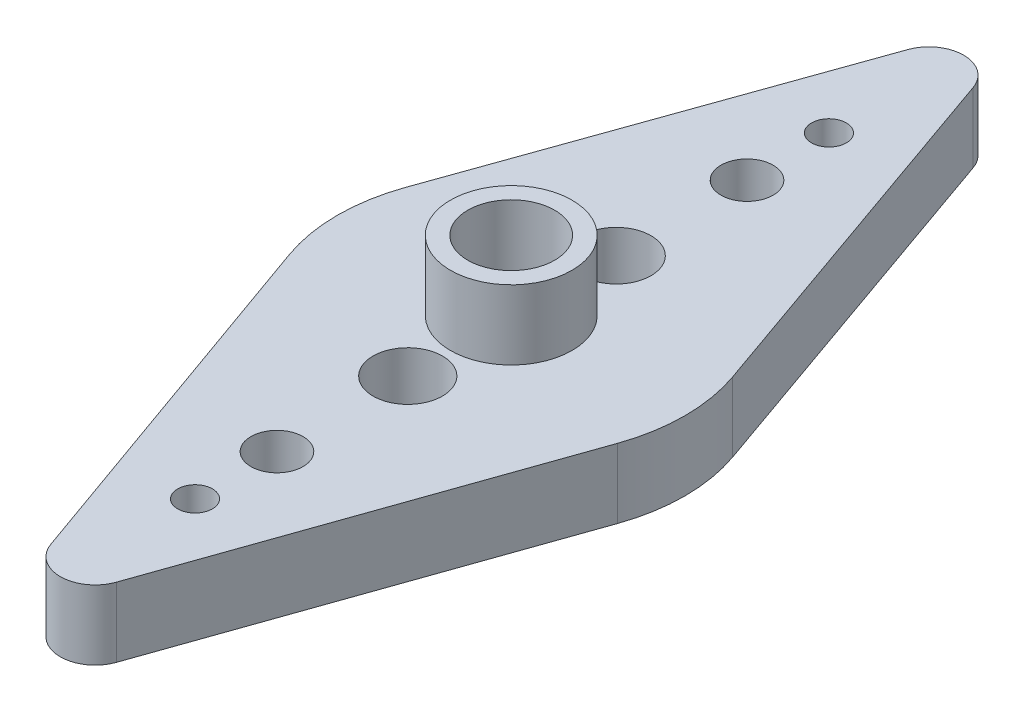
ISO-10303-21;
HEADER;
FILE_DESCRIPTION(('STEP AP214'),'2;1');
FILE_NAME('part.step','',(''),(''),'','','');
FILE_SCHEMA(('AUTOMOTIVE_DESIGN { 1 0 10303 214 1 1 1 1 }'));
ENDSEC;
DATA;
#1=APPLICATION_CONTEXT('core data for automotive mechanical design processes');
#2=APPLICATION_PROTOCOL_DEFINITION('international standard','automotive_design',2000,#1);
#3=PRODUCT_CONTEXT('',#1,'mechanical');
#4=PRODUCT('Part','Part','',(#3));
#5=PRODUCT_RELATED_PRODUCT_CATEGORY('part','',(#4));
#6=PRODUCT_DEFINITION_FORMATION('','',#4);
#7=PRODUCT_DEFINITION_CONTEXT('part definition',#1,'design');
#8=PRODUCT_DEFINITION('design','',#6,#7);
#9=PRODUCT_DEFINITION_SHAPE('','',#8);
#10=(LENGTH_UNIT() NAMED_UNIT(*) SI_UNIT(.MILLI.,.METRE.));
#11=(NAMED_UNIT(*) PLANE_ANGLE_UNIT() SI_UNIT($,.RADIAN.));
#12=(NAMED_UNIT(*) SI_UNIT($,.STERADIAN.) SOLID_ANGLE_UNIT());
#13=UNCERTAINTY_MEASURE_WITH_UNIT(LENGTH_MEASURE(1.E-05),#10,'distance_accuracy_value','');
#14=(GEOMETRIC_REPRESENTATION_CONTEXT(3) GLOBAL_UNCERTAINTY_ASSIGNED_CONTEXT((#13)) GLOBAL_UNIT_ASSIGNED_CONTEXT((#10,
#11,#12)) REPRESENTATION_CONTEXT('',''));
#15=CARTESIAN_POINT('',(0.,0.,0.));
#16=DIRECTION('',(0.,0.,1.));
#17=DIRECTION('',(1.,0.,0.));
#18=AXIS2_PLACEMENT_3D('',#15,#16,#17);
#19=CARTESIAN_POINT('',(0.,2.,0.));
#20=DIRECTION('',(0.,1.,0.));
#21=DIRECTION('',(0.,0.,1.));
#22=AXIS2_PLACEMENT_3D('',#19,#20,#21);
#23=PLANE('',#22);
#24=CARTESIAN_POINT('',(0.,2.,0.));
#25=DIRECTION('',(0.,1.,0.));
#26=DIRECTION('',(1.,0.,0.));
#27=AXIS2_PLACEMENT_3D('',#24,#25,#26);
#28=CIRCLE('',#27,1.75);
#29=CARTESIAN_POINT('',(1.75,2.,0.));
#30=VERTEX_POINT('',#29);
#31=EDGE_CURVE('E226',#30,#30,#28,.T.);
#32=ORIENTED_EDGE('',*,*,#31,.F.);
#33=EDGE_LOOP('',(#32));
#34=FACE_BOUND('',#33,.T.);
#35=CARTESIAN_POINT('',(0.0221712679038221,2.,6.76498149261645));
#36=DIRECTION('',(0.,1.,0.));
#37=DIRECTION('',(0.,0.,-1.));
#38=AXIS2_PLACEMENT_3D('',#35,#36,#37);
#39=CIRCLE('',#38,0.75);
#40=CARTESIAN_POINT('',(0.0221712679038221,2.,6.01498149261645));
#41=VERTEX_POINT('',#40);
#42=EDGE_CURVE('E211',#41,#41,#39,.T.);
#43=ORIENTED_EDGE('',*,*,#42,.F.);
#44=EDGE_LOOP('',(#43));
#45=FACE_BOUND('',#44,.T.);
#46=CARTESIAN_POINT('',(0.0221712679038221,2.,-3.000162006117));
#47=DIRECTION('',(0.,1.,0.));
#48=DIRECTION('',(0.,0.,1.));
#49=AXIS2_PLACEMENT_3D('',#46,#47,#48);
#50=CIRCLE('',#49,1.);
#51=CARTESIAN_POINT('',(0.0221712679038221,2.,-2.000162006117));
#52=VERTEX_POINT('',#51);
#53=EDGE_CURVE('E199',#52,#52,#50,.T.);
#54=ORIENTED_EDGE('',*,*,#53,.F.);
#55=EDGE_LOOP('',(#54));
#56=FACE_BOUND('',#55,.T.);
#57=CARTESIAN_POINT('',(0.0221712679038221,2.,-9.12239182528433));
#58=DIRECTION('',(0.,1.,0.));
#59=DIRECTION('',(0.,0.,1.));
#60=AXIS2_PLACEMENT_3D('',#57,#58,#59);
#61=CIRCLE('',#60,0.5);
#62=CARTESIAN_POINT('',(0.0221712679038221,2.,-8.62239182528432));
#63=VERTEX_POINT('',#62);
#64=EDGE_CURVE('E141',#63,#63,#61,.T.);
#65=ORIENTED_EDGE('',*,*,#64,.F.);
#66=EDGE_LOOP('',(#65));
#67=FACE_BOUND('',#66,.T.);
#68=CARTESIAN_POINT('',(0.,2.,0.));
#69=DIRECTION('',(0.,1.,0.));
#70=DIRECTION('',(0.,0.,1.));
#71=AXIS2_PLACEMENT_3D('',#68,#69,#70);
#72=CIRCLE('',#71,5.);
#73=CARTESIAN_POINT('',(4.71711650462551,2.,1.65795412535741));
#74=VERTEX_POINT('',#73);
#75=CARTESIAN_POINT('',(4.71711650462551,2.,-1.65795412535741));
#76=VERTEX_POINT('',#75);
#77=EDGE_CURVE('E152',#74,#76,#72,.T.);
#78=ORIENTED_EDGE('',*,*,#77,.T.);
#79=DIRECTION('',(-0.331590825071481,0.,-0.943423300925101));
#80=VECTOR('',#79,1.);
#81=CARTESIAN_POINT('',(0.965594568828934,2.,-12.331570343174));
#82=LINE('',#81,#80);
#83=CARTESIAN_POINT('',(0.965594568828934,2.,-12.331570343174));
#84=VERTEX_POINT('',#83);
#85=EDGE_CURVE('E100',#76,#84,#82,.T.);
#86=ORIENTED_EDGE('',*,*,#85,.T.);
#87=CARTESIAN_POINT('',(0.0221712679038221,2.,-11.9999795181025));
#88=DIRECTION('',(0.,1.,0.));
#89=DIRECTION('',(0.,0.,1.));
#90=AXIS2_PLACEMENT_3D('',#87,#88,#89);
#91=CIRCLE('',#90,1.);
#92=CARTESIAN_POINT('',(-0.920020295915523,2.,-12.3350542218145));
#93=VERTEX_POINT('',#92);
#94=EDGE_CURVE('E184',#84,#93,#91,.T.);
#95=ORIENTED_EDGE('',*,*,#94,.T.);
#96=DIRECTION('',(-0.335074703711991,0.,0.942191563819334));
#97=VECTOR('',#96,1.);
#98=CARTESIAN_POINT('',(-4.71095781909667,2.,-1.67537351855996));
#99=LINE('',#98,#97);
#100=CARTESIAN_POINT('',(-4.71095781909667,2.,-1.67537351855996));
#101=VERTEX_POINT('',#100);
#102=EDGE_CURVE('E183',#93,#101,#99,.T.);
#103=ORIENTED_EDGE('',*,*,#102,.T.);
#104=CARTESIAN_POINT('',(0.,2.,0.));
#105=DIRECTION('',(0.,1.,0.));
#106=DIRECTION('',(0.,0.,1.));
#107=AXIS2_PLACEMENT_3D('',#104,#105,#106);
#108=CIRCLE('',#107,5.);
#109=CARTESIAN_POINT('',(-4.71095781909667,2.,1.67537351855996));
#110=VERTEX_POINT('',#109);
#111=EDGE_CURVE('E119',#101,#110,#108,.T.);
#112=ORIENTED_EDGE('',*,*,#111,.T.);
#113=DIRECTION('',(0.335074703711991,0.,0.942191563819334));
#114=VECTOR('',#113,1.);
#115=CARTESIAN_POINT('',(-4.71095781909667,2.,1.67537351855996));
#116=LINE('',#115,#114);
#117=CARTESIAN_POINT('',(-0.920020295915522,2.,12.3350542218145));
#118=VERTEX_POINT('',#117);
#119=EDGE_CURVE('E113',#110,#118,#116,.T.);
#120=ORIENTED_EDGE('',*,*,#119,.T.);
#121=CARTESIAN_POINT('',(0.0221712679038221,2.,11.9999795181025));
#122=DIRECTION('',(0.,1.,0.));
#123=DIRECTION('',(0.,0.,-1.));
#124=AXIS2_PLACEMENT_3D('',#121,#122,#123);
#125=CIRCLE('',#124,1.);
#126=CARTESIAN_POINT('',(0.965594568828934,2.,12.331570343174));
#127=VERTEX_POINT('',#126);
#128=EDGE_CURVE('E117',#118,#127,#125,.T.);
#129=ORIENTED_EDGE('',*,*,#128,.T.);
#130=DIRECTION('',(0.331590825071481,0.,-0.943423300925101));
#131=VECTOR('',#130,1.);
#132=CARTESIAN_POINT('',(0.965594568828934,2.,12.331570343174));
#133=LINE('',#132,#131);
#134=EDGE_CURVE('E56',#127,#74,#133,.T.);
#135=ORIENTED_EDGE('',*,*,#134,.T.);
#136=EDGE_LOOP('',(#78,#86,#95,#103,#112,#120,#129,#135));
#137=FACE_BOUND('',#136,.T.);
#138=CARTESIAN_POINT('',(0.0221712679038221,2.,-6.76498149261645));
#139=DIRECTION('',(0.,1.,0.));
#140=DIRECTION('',(0.,0.,1.));
#141=AXIS2_PLACEMENT_3D('',#138,#139,#140);
#142=CIRCLE('',#141,0.75);
#143=CARTESIAN_POINT('',(0.0221712679038221,2.,-6.01498149261645));
#144=VERTEX_POINT('',#143);
#145=EDGE_CURVE('E193',#144,#144,#142,.T.);
#146=ORIENTED_EDGE('',*,*,#145,.F.);
#147=EDGE_LOOP('',(#146));
#148=FACE_BOUND('',#147,.T.);
#149=CARTESIAN_POINT('',(0.0221712679038221,2.,9.12239182528433));
#150=DIRECTION('',(0.,1.,0.));
#151=DIRECTION('',(0.,0.,-1.));
#152=AXIS2_PLACEMENT_3D('',#149,#150,#151);
#153=CIRCLE('',#152,0.5);
#154=CARTESIAN_POINT('',(0.0221712679038221,2.,8.62239182528432));
#155=VERTEX_POINT('',#154);
#156=EDGE_CURVE('E205',#155,#155,#153,.T.);
#157=ORIENTED_EDGE('',*,*,#156,.F.);
#158=EDGE_LOOP('',(#157));
#159=FACE_BOUND('',#158,.T.);
#160=CARTESIAN_POINT('',(0.0221712679038221,2.,3.000162006117));
#161=DIRECTION('',(0.,1.,0.));
#162=DIRECTION('',(0.,0.,-1.));
#163=AXIS2_PLACEMENT_3D('',#160,#161,#162);
#164=CIRCLE('',#163,1.);
#165=CARTESIAN_POINT('',(0.0221712679038221,2.,2.000162006117));
#166=VERTEX_POINT('',#165);
#167=EDGE_CURVE('E217',#166,#166,#164,.T.);
#168=ORIENTED_EDGE('',*,*,#167,.F.);
#169=EDGE_LOOP('',(#168));
#170=FACE_BOUND('',#169,.T.);
#171=ADVANCED_FACE('F39',(#34,#45,#56,#67,#137,#148,#159,#170),#23,.T.);
#172=CARTESIAN_POINT('',(0.,0.,0.));
#173=DIRECTION('',(0.,1.,0.));
#174=DIRECTION('',(0.,0.,1.));
#175=AXIS2_PLACEMENT_3D('',#172,#173,#174);
#176=PLANE('',#175);
#177=CARTESIAN_POINT('',(0.,0.,0.));
#178=DIRECTION('',(0.,1.,0.));
#179=DIRECTION('',(0.,0.,1.));
#180=AXIS2_PLACEMENT_3D('',#177,#178,#179);
#181=CIRCLE('',#180,5.);
#182=CARTESIAN_POINT('',(4.71711650462551,0.,1.65795412535741));
#183=VERTEX_POINT('',#182);
#184=CARTESIAN_POINT('',(4.71711650462551,0.,-1.65795412535741));
#185=VERTEX_POINT('',#184);
#186=EDGE_CURVE('E137',#183,#185,#181,.T.);
#187=ORIENTED_EDGE('',*,*,#186,.F.);
#188=DIRECTION('',(0.331590825071481,0.,-0.943423300925101));
#189=VECTOR('',#188,1.);
#190=CARTESIAN_POINT('',(0.965594568828934,0.,12.331570343174));
#191=LINE('',#190,#189);
#192=CARTESIAN_POINT('',(0.965594568828934,0.,12.331570343174));
#193=VERTEX_POINT('',#192);
#194=EDGE_CURVE('E91',#193,#183,#191,.T.);
#195=ORIENTED_EDGE('',*,*,#194,.F.);
#196=CARTESIAN_POINT('',(0.0221712679038221,0.,11.9999795181025));
#197=DIRECTION('',(0.,1.,0.));
#198=DIRECTION('',(0.,0.,-1.));
#199=AXIS2_PLACEMENT_3D('',#196,#197,#198);
#200=CIRCLE('',#199,1.);
#201=CARTESIAN_POINT('',(-0.920020295915522,0.,12.3350542218145));
#202=VERTEX_POINT('',#201);
#203=EDGE_CURVE('E85',#202,#193,#200,.T.);
#204=ORIENTED_EDGE('',*,*,#203,.F.);
#205=DIRECTION('',(0.335074703711991,0.,0.942191563819334));
#206=VECTOR('',#205,1.);
#207=CARTESIAN_POINT('',(-4.71095781909667,0.,1.67537351855996));
#208=LINE('',#207,#206);
#209=CARTESIAN_POINT('',(-4.71095781909667,0.,1.67537351855996));
#210=VERTEX_POINT('',#209);
#211=EDGE_CURVE('E127',#210,#202,#208,.T.);
#212=ORIENTED_EDGE('',*,*,#211,.F.);
#213=CARTESIAN_POINT('',(0.,0.,0.));
#214=DIRECTION('',(0.,1.,0.));
#215=DIRECTION('',(0.,0.,1.));
#216=AXIS2_PLACEMENT_3D('',#213,#214,#215);
#217=CIRCLE('',#216,5.);
#218=CARTESIAN_POINT('',(-4.71095781909667,0.,-1.67537351855996));
#219=VERTEX_POINT('',#218);
#220=EDGE_CURVE('E147',#219,#210,#217,.T.);
#221=ORIENTED_EDGE('',*,*,#220,.F.);
#222=DIRECTION('',(-0.335074703711991,0.,0.942191563819334));
#223=VECTOR('',#222,1.);
#224=CARTESIAN_POINT('',(-4.71095781909667,0.,-1.67537351855996));
#225=LINE('',#224,#223);
#226=CARTESIAN_POINT('',(-0.920020295915523,0.,-12.3350542218145));
#227=VERTEX_POINT('',#226);
#228=EDGE_CURVE('E145',#227,#219,#225,.T.);
#229=ORIENTED_EDGE('',*,*,#228,.F.);
#230=CARTESIAN_POINT('',(0.0221712679038221,0.,-11.9999795181025));
#231=DIRECTION('',(0.,1.,0.));
#232=DIRECTION('',(0.,0.,1.));
#233=AXIS2_PLACEMENT_3D('',#230,#231,#232);
#234=CIRCLE('',#233,1.);
#235=CARTESIAN_POINT('',(0.965594568828934,0.,-12.331570343174));
#236=VERTEX_POINT('',#235);
#237=EDGE_CURVE('E143',#236,#227,#234,.T.);
#238=ORIENTED_EDGE('',*,*,#237,.F.);
#239=DIRECTION('',(-0.331590825071481,0.,-0.943423300925101));
#240=VECTOR('',#239,1.);
#241=CARTESIAN_POINT('',(0.965594568828934,0.,-12.331570343174));
#242=LINE('',#241,#240);
#243=EDGE_CURVE('E140',#185,#236,#242,.T.);
#244=ORIENTED_EDGE('',*,*,#243,.F.);
#245=EDGE_LOOP('',(#187,#195,#204,#212,#221,#229,#238,#244));
#246=FACE_BOUND('',#245,.T.);
#247=CARTESIAN_POINT('',(0.0221712679038221,0.,-9.12239182528433));
#248=DIRECTION('',(0.,1.,0.));
#249=DIRECTION('',(0.,0.,1.));
#250=AXIS2_PLACEMENT_3D('',#247,#248,#249);
#251=CIRCLE('',#250,0.5);
#252=CARTESIAN_POINT('',(0.0221712679038221,0.,-8.62239182528432));
#253=VERTEX_POINT('',#252);
#254=EDGE_CURVE('E190',#253,#253,#251,.T.);
#255=ORIENTED_EDGE('',*,*,#254,.T.);
#256=EDGE_LOOP('',(#255));
#257=FACE_BOUND('',#256,.T.);
#258=CARTESIAN_POINT('',(0.0221712679038221,0.,-6.76498149261645));
#259=DIRECTION('',(0.,1.,0.));
#260=DIRECTION('',(0.,0.,1.));
#261=AXIS2_PLACEMENT_3D('',#258,#259,#260);
#262=CIRCLE('',#261,0.75);
#263=CARTESIAN_POINT('',(0.0221712679038221,0.,-6.01498149261645));
#264=VERTEX_POINT('',#263);
#265=EDGE_CURVE('E196',#264,#264,#262,.T.);
#266=ORIENTED_EDGE('',*,*,#265,.T.);
#267=EDGE_LOOP('',(#266));
#268=FACE_BOUND('',#267,.T.);
#269=CARTESIAN_POINT('',(0.0221712679038221,0.,-3.000162006117));
#270=DIRECTION('',(0.,1.,0.));
#271=DIRECTION('',(0.,0.,1.));
#272=AXIS2_PLACEMENT_3D('',#269,#270,#271);
#273=CIRCLE('',#272,1.);
#274=CARTESIAN_POINT('',(0.0221712679038221,0.,-2.000162006117));
#275=VERTEX_POINT('',#274);
#276=EDGE_CURVE('E202',#275,#275,#273,.T.);
#277=ORIENTED_EDGE('',*,*,#276,.T.);
#278=EDGE_LOOP('',(#277));
#279=FACE_BOUND('',#278,.T.);
#280=CARTESIAN_POINT('',(0.0221712679038221,0.,9.12239182528433));
#281=DIRECTION('',(0.,1.,0.));
#282=DIRECTION('',(0.,0.,-1.));
#283=AXIS2_PLACEMENT_3D('',#280,#281,#282);
#284=CIRCLE('',#283,0.5);
#285=CARTESIAN_POINT('',(0.0221712679038221,0.,8.62239182528432));
#286=VERTEX_POINT('',#285);
#287=EDGE_CURVE('E208',#286,#286,#284,.T.);
#288=ORIENTED_EDGE('',*,*,#287,.T.);
#289=EDGE_LOOP('',(#288));
#290=FACE_BOUND('',#289,.T.);
#291=CARTESIAN_POINT('',(0.0221712679038221,0.,6.76498149261645));
#292=DIRECTION('',(0.,1.,0.));
#293=DIRECTION('',(0.,0.,-1.));
#294=AXIS2_PLACEMENT_3D('',#291,#292,#293);
#295=CIRCLE('',#294,0.75);
#296=CARTESIAN_POINT('',(0.0221712679038221,0.,6.01498149261645));
#297=VERTEX_POINT('',#296);
#298=EDGE_CURVE('E214',#297,#297,#295,.T.);
#299=ORIENTED_EDGE('',*,*,#298,.T.);
#300=EDGE_LOOP('',(#299));
#301=FACE_BOUND('',#300,.T.);
#302=CARTESIAN_POINT('',(0.0221712679038221,0.,3.000162006117));
#303=DIRECTION('',(0.,1.,0.));
#304=DIRECTION('',(0.,0.,-1.));
#305=AXIS2_PLACEMENT_3D('',#302,#303,#304);
#306=CIRCLE('',#305,1.);
#307=CARTESIAN_POINT('',(0.0221712679038221,0.,2.000162006117));
#308=VERTEX_POINT('',#307);
#309=EDGE_CURVE('E220',#308,#308,#306,.T.);
#310=ORIENTED_EDGE('',*,*,#309,.T.);
#311=EDGE_LOOP('',(#310));
#312=FACE_BOUND('',#311,.T.);
#313=ADVANCED_FACE('F170',(#246,#257,#268,#279,#290,#301,#312),#176,.F.);
#314=CARTESIAN_POINT('',(0.,2.,0.));
#315=DIRECTION('',(0.,-1.,0.));
#316=DIRECTION('',(0.,0.,-1.));
#317=AXIS2_PLACEMENT_3D('',#314,#315,#316);
#318=CYLINDRICAL_SURFACE('',#317,5.);
#319=ORIENTED_EDGE('',*,*,#186,.T.);
#320=DIRECTION('',(0.,-1.,0.));
#321=VECTOR('',#320,1.);
#322=CARTESIAN_POINT('',(4.71711650462551,2.,-1.65795412535741));
#323=LINE('',#322,#321);
#324=EDGE_CURVE('E48',#76,#185,#323,.T.);
#325=ORIENTED_EDGE('',*,*,#324,.F.);
#326=ORIENTED_EDGE('',*,*,#77,.F.);
#327=DIRECTION('',(0.,-1.,0.));
#328=VECTOR('',#327,1.);
#329=CARTESIAN_POINT('',(4.71711650462551,2.,1.65795412535741));
#330=LINE('',#329,#328);
#331=EDGE_CURVE('E133',#74,#183,#330,.T.);
#332=ORIENTED_EDGE('',*,*,#331,.T.);
#333=EDGE_LOOP('',(#319,#325,#326,#332));
#334=FACE_BOUND('',#333,.T.);
#335=ADVANCED_FACE('F41',(#334),#318,.T.);
#336=CARTESIAN_POINT('',(0.965594568828934,2.,-12.331570343174));
#337=DIRECTION('',(-0.943423300925101,0.,0.331590825071481));
#338=DIRECTION('',(0.331590825071481,0.,0.943423300925102));
#339=AXIS2_PLACEMENT_3D('',#336,#337,#338);
#340=PLANE('',#339);
#341=ORIENTED_EDGE('',*,*,#243,.T.);
#342=DIRECTION('',(0.,-1.,0.));
#343=VECTOR('',#342,1.);
#344=CARTESIAN_POINT('',(0.965594568828934,2.,-12.331570343174));
#345=LINE('',#344,#343);
#346=EDGE_CURVE('E162',#84,#236,#345,.T.);
#347=ORIENTED_EDGE('',*,*,#346,.F.);
#348=ORIENTED_EDGE('',*,*,#85,.F.);
#349=ORIENTED_EDGE('',*,*,#324,.T.);
#350=EDGE_LOOP('',(#341,#347,#348,#349));
#351=FACE_BOUND('',#350,.T.);
#352=ADVANCED_FACE('F165',(#351),#340,.F.);
#353=CARTESIAN_POINT('',(0.0221712679038221,2.,-11.9999795181025));
#354=DIRECTION('',(0.,-1.,0.));
#355=DIRECTION('',(0.,0.,-1.));
#356=AXIS2_PLACEMENT_3D('',#353,#354,#355);
#357=CYLINDRICAL_SURFACE('',#356,1.);
#358=ORIENTED_EDGE('',*,*,#237,.T.);
#359=DIRECTION('',(0.,-1.,0.));
#360=VECTOR('',#359,1.);
#361=CARTESIAN_POINT('',(-0.920020295915523,2.,-12.3350542218145));
#362=LINE('',#361,#360);
#363=EDGE_CURVE('E159',#93,#227,#362,.T.);
#364=ORIENTED_EDGE('',*,*,#363,.F.);
#365=ORIENTED_EDGE('',*,*,#94,.F.);
#366=ORIENTED_EDGE('',*,*,#346,.T.);
#367=EDGE_LOOP('',(#358,#364,#365,#366));
#368=FACE_BOUND('',#367,.T.);
#369=ADVANCED_FACE('F177',(#368),#357,.T.);
#370=CARTESIAN_POINT('',(-4.71095781909667,2.,-1.67537351855996));
#371=DIRECTION('',(0.942191563819334,0.,0.335074703711991));
#372=DIRECTION('',(0.335074703711991,0.,-0.942191563819334));
#373=AXIS2_PLACEMENT_3D('',#370,#371,#372);
#374=PLANE('',#373);
#375=ORIENTED_EDGE('',*,*,#228,.T.);
#376=DIRECTION('',(0.,-1.,0.));
#377=VECTOR('',#376,1.);
#378=CARTESIAN_POINT('',(-4.71095781909667,2.,-1.67537351855996));
#379=LINE('',#378,#377);
#380=EDGE_CURVE('E156',#101,#219,#379,.T.);
#381=ORIENTED_EDGE('',*,*,#380,.F.);
#382=ORIENTED_EDGE('',*,*,#102,.F.);
#383=ORIENTED_EDGE('',*,*,#363,.T.);
#384=EDGE_LOOP('',(#375,#381,#382,#383));
#385=FACE_BOUND('',#384,.T.);
#386=ADVANCED_FACE('F181',(#385),#374,.F.);
#387=CARTESIAN_POINT('',(0.,2.,0.));
#388=DIRECTION('',(0.,-1.,0.));
#389=DIRECTION('',(0.,0.,-1.));
#390=AXIS2_PLACEMENT_3D('',#387,#388,#389);
#391=CYLINDRICAL_SURFACE('',#390,5.);
#392=ORIENTED_EDGE('',*,*,#220,.T.);
#393=DIRECTION('',(0.,-1.,0.));
#394=VECTOR('',#393,1.);
#395=CARTESIAN_POINT('',(-4.71095781909667,2.,1.67537351855996));
#396=LINE('',#395,#394);
#397=EDGE_CURVE('E128',#110,#210,#396,.T.);
#398=ORIENTED_EDGE('',*,*,#397,.F.);
#399=ORIENTED_EDGE('',*,*,#111,.F.);
#400=ORIENTED_EDGE('',*,*,#380,.T.);
#401=EDGE_LOOP('',(#392,#398,#399,#400));
#402=FACE_BOUND('',#401,.T.);
#403=ADVANCED_FACE('F367',(#402),#391,.T.);
#404=CARTESIAN_POINT('',(-4.71095781909667,2.,1.67537351855996));
#405=DIRECTION('',(0.942191563819334,0.,-0.335074703711991));
#406=DIRECTION('',(-0.335074703711991,0.,-0.942191563819334));
#407=AXIS2_PLACEMENT_3D('',#404,#405,#406);
#408=PLANE('',#407);
#409=ORIENTED_EDGE('',*,*,#211,.T.);
#410=DIRECTION('',(0.,-1.,0.));
#411=VECTOR('',#410,1.);
#412=CARTESIAN_POINT('',(-0.920020295915522,2.,12.3350542218145));
#413=LINE('',#412,#411);
#414=EDGE_CURVE('E124',#118,#202,#413,.T.);
#415=ORIENTED_EDGE('',*,*,#414,.F.);
#416=ORIENTED_EDGE('',*,*,#119,.F.);
#417=ORIENTED_EDGE('',*,*,#397,.T.);
#418=EDGE_LOOP('',(#409,#415,#416,#417));
#419=FACE_BOUND('',#418,.T.);
#420=ADVANCED_FACE('F125',(#419),#408,.F.);
#421=CARTESIAN_POINT('',(0.0221712679038221,2.,11.9999795181025));
#422=DIRECTION('',(0.,-1.,0.));
#423=DIRECTION('',(0.,0.,-1.));
#424=AXIS2_PLACEMENT_3D('',#421,#422,#423);
#425=CYLINDRICAL_SURFACE('',#424,1.);
#426=ORIENTED_EDGE('',*,*,#203,.T.);
#427=DIRECTION('',(0.,-1.,0.));
#428=VECTOR('',#427,1.);
#429=CARTESIAN_POINT('',(0.965594568828934,2.,12.331570343174));
#430=LINE('',#429,#428);
#431=EDGE_CURVE('E129',#127,#193,#430,.T.);
#432=ORIENTED_EDGE('',*,*,#431,.F.);
#433=ORIENTED_EDGE('',*,*,#128,.F.);
#434=ORIENTED_EDGE('',*,*,#414,.T.);
#435=EDGE_LOOP('',(#426,#432,#433,#434));
#436=FACE_BOUND('',#435,.T.);
#437=ADVANCED_FACE('F131',(#436),#425,.T.);
#438=CARTESIAN_POINT('',(0.965594568828934,2.,12.331570343174));
#439=DIRECTION('',(-0.943423300925101,0.,-0.331590825071481));
#440=DIRECTION('',(-0.331590825071481,0.,0.943423300925102));
#441=AXIS2_PLACEMENT_3D('',#438,#439,#440);
#442=PLANE('',#441);
#443=ORIENTED_EDGE('',*,*,#194,.T.);
#444=ORIENTED_EDGE('',*,*,#331,.F.);
#445=ORIENTED_EDGE('',*,*,#134,.F.);
#446=ORIENTED_EDGE('',*,*,#431,.T.);
#447=EDGE_LOOP('',(#443,#444,#445,#446));
#448=FACE_BOUND('',#447,.T.);
#449=ADVANCED_FACE('F342',(#448),#442,.F.);
#450=CARTESIAN_POINT('',(0.0221712679038221,2.,-9.12239182528433));
#451=DIRECTION('',(0.,-1.,0.));
#452=DIRECTION('',(0.,0.,-1.));
#453=AXIS2_PLACEMENT_3D('',#450,#451,#452);
#454=CYLINDRICAL_SURFACE('',#453,0.5);
#455=ORIENTED_EDGE('',*,*,#64,.T.);
#456=EDGE_LOOP('',(#455));
#457=FACE_BOUND('',#456,.T.);
#458=ORIENTED_EDGE('',*,*,#254,.F.);
#459=EDGE_LOOP('',(#458));
#460=FACE_BOUND('',#459,.T.);
#461=ADVANCED_FACE('F332',(#457,#460),#454,.F.);
#462=CARTESIAN_POINT('',(0.0221712679038221,2.,-6.76498149261645));
#463=DIRECTION('',(0.,-1.,0.));
#464=DIRECTION('',(0.,0.,-1.));
#465=AXIS2_PLACEMENT_3D('',#462,#463,#464);
#466=CYLINDRICAL_SURFACE('',#465,0.75);
#467=ORIENTED_EDGE('',*,*,#145,.T.);
#468=EDGE_LOOP('',(#467));
#469=FACE_BOUND('',#468,.T.);
#470=ORIENTED_EDGE('',*,*,#265,.F.);
#471=EDGE_LOOP('',(#470));
#472=FACE_BOUND('',#471,.T.);
#473=ADVANCED_FACE('F322',(#469,#472),#466,.F.);
#474=CARTESIAN_POINT('',(0.0221712679038221,2.,-3.000162006117));
#475=DIRECTION('',(0.,-1.,0.));
#476=DIRECTION('',(0.,0.,-1.));
#477=AXIS2_PLACEMENT_3D('',#474,#475,#476);
#478=CYLINDRICAL_SURFACE('',#477,1.);
#479=ORIENTED_EDGE('',*,*,#53,.T.);
#480=EDGE_LOOP('',(#479));
#481=FACE_BOUND('',#480,.T.);
#482=ORIENTED_EDGE('',*,*,#276,.F.);
#483=EDGE_LOOP('',(#482));
#484=FACE_BOUND('',#483,.T.);
#485=ADVANCED_FACE('F312',(#481,#484),#478,.F.);
#486=CARTESIAN_POINT('',(0.0221712679038221,2.,9.12239182528433));
#487=DIRECTION('',(0.,-1.,0.));
#488=DIRECTION('',(0.,0.,-1.));
#489=AXIS2_PLACEMENT_3D('',#486,#487,#488);
#490=CYLINDRICAL_SURFACE('',#489,0.5);
#491=ORIENTED_EDGE('',*,*,#156,.T.);
#492=EDGE_LOOP('',(#491));
#493=FACE_BOUND('',#492,.T.);
#494=ORIENTED_EDGE('',*,*,#287,.F.);
#495=EDGE_LOOP('',(#494));
#496=FACE_BOUND('',#495,.T.);
#497=ADVANCED_FACE('F302',(#493,#496),#490,.F.);
#498=CARTESIAN_POINT('',(0.0221712679038221,2.,6.76498149261645));
#499=DIRECTION('',(0.,-1.,0.));
#500=DIRECTION('',(0.,0.,-1.));
#501=AXIS2_PLACEMENT_3D('',#498,#499,#500);
#502=CYLINDRICAL_SURFACE('',#501,0.75);
#503=ORIENTED_EDGE('',*,*,#42,.T.);
#504=EDGE_LOOP('',(#503));
#505=FACE_BOUND('',#504,.T.);
#506=ORIENTED_EDGE('',*,*,#298,.F.);
#507=EDGE_LOOP('',(#506));
#508=FACE_BOUND('',#507,.T.);
#509=ADVANCED_FACE('F250',(#505,#508),#502,.F.);
#510=CARTESIAN_POINT('',(0.0221712679038221,2.,3.000162006117));
#511=DIRECTION('',(0.,-1.,0.));
#512=DIRECTION('',(0.,0.,-1.));
#513=AXIS2_PLACEMENT_3D('',#510,#511,#512);
#514=CYLINDRICAL_SURFACE('',#513,1.);
#515=ORIENTED_EDGE('',*,*,#167,.T.);
#516=EDGE_LOOP('',(#515));
#517=FACE_BOUND('',#516,.T.);
#518=ORIENTED_EDGE('',*,*,#309,.F.);
#519=EDGE_LOOP('',(#518));
#520=FACE_BOUND('',#519,.T.);
#521=ADVANCED_FACE('F241',(#517,#520),#514,.F.);
#522=CARTESIAN_POINT('',(0.,4.,0.));
#523=DIRECTION('',(0.,1.,0.));
#524=DIRECTION('',(0.,0.,1.));
#525=AXIS2_PLACEMENT_3D('',#522,#523,#524);
#526=PLANE('',#525);
#527=CARTESIAN_POINT('',(0.,4.,0.));
#528=DIRECTION('',(0.,1.,0.));
#529=DIRECTION('',(1.,0.,0.));
#530=AXIS2_PLACEMENT_3D('',#527,#528,#529);
#531=CIRCLE('',#530,1.75);
#532=CARTESIAN_POINT('',(1.75,4.,0.));
#533=VERTEX_POINT('',#532);
#534=EDGE_CURVE('E223',#533,#533,#531,.T.);
#535=ORIENTED_EDGE('',*,*,#534,.T.);
#536=EDGE_LOOP('',(#535));
#537=FACE_BOUND('',#536,.T.);
#538=CARTESIAN_POINT('',(0.,4.,0.));
#539=DIRECTION('',(0.,1.,0.));
#540=DIRECTION('',(0.,0.,1.));
#541=AXIS2_PLACEMENT_3D('',#538,#539,#540);
#542=CIRCLE('',#541,1.25);
#543=CARTESIAN_POINT('',(0.,4.,1.25));
#544=VERTEX_POINT('',#543);
#545=EDGE_CURVE('E229',#544,#544,#542,.T.);
#546=ORIENTED_EDGE('',*,*,#545,.F.);
#547=EDGE_LOOP('',(#546));
#548=FACE_BOUND('',#547,.T.);
#549=ADVANCED_FACE('F238',(#537,#548),#526,.T.);
#550=CARTESIAN_POINT('',(0.,4.,0.));
#551=DIRECTION('',(0.,-1.,0.));
#552=DIRECTION('',(0.,0.,-1.));
#553=AXIS2_PLACEMENT_3D('',#550,#551,#552);
#554=CYLINDRICAL_SURFACE('',#553,1.75);
#555=ORIENTED_EDGE('',*,*,#534,.F.);
#556=EDGE_LOOP('',(#555));
#557=FACE_BOUND('',#556,.T.);
#558=ORIENTED_EDGE('',*,*,#31,.T.);
#559=EDGE_LOOP('',(#558));
#560=FACE_BOUND('',#559,.T.);
#561=ADVANCED_FACE('F240',(#557,#560),#554,.T.);
#562=CARTESIAN_POINT('',(0.,4.,0.));
#563=DIRECTION('',(0.,-1.,0.));
#564=DIRECTION('',(0.,0.,-1.));
#565=AXIS2_PLACEMENT_3D('',#562,#563,#564);
#566=CYLINDRICAL_SURFACE('',#565,1.25);
#567=ORIENTED_EDGE('',*,*,#545,.T.);
#568=EDGE_LOOP('',(#567));
#569=FACE_BOUND('',#568,.T.);
#570=CARTESIAN_POINT('',(0.,2.,0.));
#571=DIRECTION('',(0.,1.,0.));
#572=DIRECTION('',(0.,0.,1.));
#573=AXIS2_PLACEMENT_3D('',#570,#571,#572);
#574=CIRCLE('',#573,1.25);
#575=CARTESIAN_POINT('',(0.,2.,1.25));
#576=VERTEX_POINT('',#575);
#577=EDGE_CURVE('E12',#576,#576,#574,.F.);
#578=ORIENTED_EDGE('',*,*,#577,.T.);
#579=EDGE_LOOP('',(#578));
#580=FACE_BOUND('',#579,.T.);
#581=ADVANCED_FACE('F235',(#569,#580),#566,.F.);
#582=ORIENTED_EDGE('',*,*,#577,.F.);
#583=EDGE_LOOP('',(#582));
#584=FACE_BOUND('',#583,.T.);
#585=ADVANCED_FACE('F257',(#584),#23,.T.);
#586=CLOSED_SHELL('',(#171,#313,#335,#352,#369,#386,#403,#420,#437,#449,#461,#473,#485,#497,
#509,#521,#549,#561,#581,#585));
#587=MANIFOLD_SOLID_BREP('B2',#586);
#588=ADVANCED_BREP_SHAPE_REPRESENTATION('',(#18,#587),#14);
#589=SHAPE_DEFINITION_REPRESENTATION(#9,#588);
ENDSEC;
END-ISO-10303-21;
